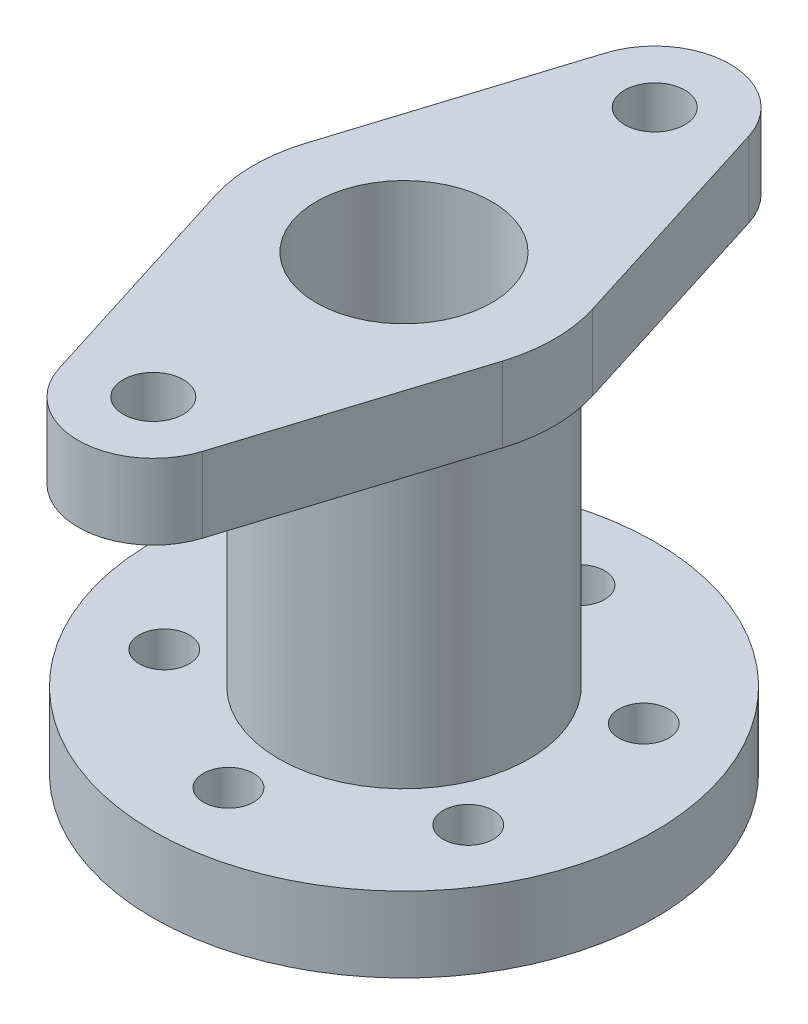
ISO-10303-21;
HEADER;
FILE_DESCRIPTION(('STEP AP214'),'2;1');
FILE_NAME('part.step','',(''),(''),'','','');
FILE_SCHEMA(('AUTOMOTIVE_DESIGN { 1 0 10303 214 1 1 1 1 }'));
ENDSEC;
DATA;
#1=APPLICATION_CONTEXT('core data for automotive mechanical design processes');
#2=APPLICATION_PROTOCOL_DEFINITION('international standard','automotive_design',2000,#1);
#3=PRODUCT_CONTEXT('',#1,'mechanical');
#4=PRODUCT('Part','Part','',(#3));
#5=PRODUCT_RELATED_PRODUCT_CATEGORY('part','',(#4));
#6=PRODUCT_DEFINITION_FORMATION('','',#4);
#7=PRODUCT_DEFINITION_CONTEXT('part definition',#1,'design');
#8=PRODUCT_DEFINITION('design','',#6,#7);
#9=PRODUCT_DEFINITION_SHAPE('','',#8);
#10=(LENGTH_UNIT() NAMED_UNIT(*) SI_UNIT(.MILLI.,.METRE.));
#11=(NAMED_UNIT(*) PLANE_ANGLE_UNIT() SI_UNIT($,.RADIAN.));
#12=(NAMED_UNIT(*) SI_UNIT($,.STERADIAN.) SOLID_ANGLE_UNIT());
#13=UNCERTAINTY_MEASURE_WITH_UNIT(LENGTH_MEASURE(1.E-05),#10,'distance_accuracy_value','');
#14=(GEOMETRIC_REPRESENTATION_CONTEXT(3) GLOBAL_UNCERTAINTY_ASSIGNED_CONTEXT((#13)) GLOBAL_UNIT_ASSIGNED_CONTEXT((#10,
#11,#12)) REPRESENTATION_CONTEXT('',''));
#15=CARTESIAN_POINT('',(0.,0.,0.));
#16=DIRECTION('',(0.,0.,1.));
#17=DIRECTION('',(1.,0.,0.));
#18=AXIS2_PLACEMENT_3D('',#15,#16,#17);
#19=CARTESIAN_POINT('',(0.,15.,0.));
#20=DIRECTION('',(0.,-1.,0.));
#21=DIRECTION('',(0.,0.,-1.));
#22=AXIS2_PLACEMENT_3D('',#19,#20,#21);
#23=CYLINDRICAL_SURFACE('',#22,50.);
#24=CARTESIAN_POINT('',(0.,15.,0.));
#25=DIRECTION('',(0.,1.,0.));
#26=DIRECTION('',(0.,0.,1.));
#27=AXIS2_PLACEMENT_3D('',#24,#25,#26);
#28=CIRCLE('',#27,50.);
#29=CARTESIAN_POINT('',(0.,15.,50.));
#30=VERTEX_POINT('',#29);
#31=EDGE_CURVE('E65',#30,#30,#28,.T.);
#32=ORIENTED_EDGE('',*,*,#31,.F.);
#33=EDGE_LOOP('',(#32));
#34=FACE_BOUND('',#33,.T.);
#35=CARTESIAN_POINT('',(0.,0.,0.));
#36=DIRECTION('',(0.,1.,0.));
#37=DIRECTION('',(0.,0.,1.));
#38=AXIS2_PLACEMENT_3D('',#35,#36,#37);
#39=CIRCLE('',#38,50.);
#40=CARTESIAN_POINT('',(0.,0.,50.));
#41=VERTEX_POINT('',#40);
#42=EDGE_CURVE('E217',#41,#41,#39,.T.);
#43=ORIENTED_EDGE('',*,*,#42,.T.);
#44=EDGE_LOOP('',(#43));
#45=FACE_BOUND('',#44,.T.);
#46=ADVANCED_FACE('F55',(#34,#45),#23,.T.);
#47=CARTESIAN_POINT('',(0.,15.,0.));
#48=DIRECTION('',(0.,1.,0.));
#49=DIRECTION('',(0.,0.,1.));
#50=AXIS2_PLACEMENT_3D('',#47,#48,#49);
#51=PLANE('',#50);
#52=CARTESIAN_POINT('',(0.,15.,0.));
#53=DIRECTION('',(0.,1.,0.));
#54=DIRECTION('',(0.,0.,1.));
#55=AXIS2_PLACEMENT_3D('',#52,#53,#54);
#56=CIRCLE('',#55,25.);
#57=CARTESIAN_POINT('',(0.,15.,25.));
#58=VERTEX_POINT('',#57);
#59=EDGE_CURVE('E204',#58,#58,#56,.T.);
#60=ORIENTED_EDGE('',*,*,#59,.F.);
#61=EDGE_LOOP('',(#60));
#62=FACE_BOUND('',#61,.T.);
#63=CARTESIAN_POINT('',(0.,15.,-35.));
#64=DIRECTION('',(0.,1.,0.));
#65=DIRECTION('',(0.,0.,1.));
#66=AXIS2_PLACEMENT_3D('',#63,#64,#65);
#67=CIRCLE('',#66,5.);
#68=CARTESIAN_POINT('',(0.,15.,-30.));
#69=VERTEX_POINT('',#68);
#70=EDGE_CURVE('E218',#69,#69,#67,.T.);
#71=ORIENTED_EDGE('',*,*,#70,.F.);
#72=EDGE_LOOP('',(#71));
#73=FACE_BOUND('',#72,.T.);
#74=CARTESIAN_POINT('',(-30.3108891324552,15.,-17.5000000000004));
#75=DIRECTION('',(0.,1.,0.));
#76=DIRECTION('',(0.,0.,1.));
#77=AXIS2_PLACEMENT_3D('',#74,#75,#76);
#78=CIRCLE('',#77,5.);
#79=CARTESIAN_POINT('',(-30.3108891324552,15.,-12.5000000000004));
#80=VERTEX_POINT('',#79);
#81=EDGE_CURVE('E223',#80,#80,#78,.T.);
#82=ORIENTED_EDGE('',*,*,#81,.F.);
#83=EDGE_LOOP('',(#82));
#84=FACE_BOUND('',#83,.T.);
#85=CARTESIAN_POINT('',(-30.3108891324555,15.,17.4999999999997));
#86=DIRECTION('',(0.,1.,0.));
#87=DIRECTION('',(0.,0.,1.));
#88=AXIS2_PLACEMENT_3D('',#85,#86,#87);
#89=CIRCLE('',#88,5.);
#90=CARTESIAN_POINT('',(-30.3108891324555,15.,22.4999999999997));
#91=VERTEX_POINT('',#90);
#92=EDGE_CURVE('E254',#91,#91,#89,.T.);
#93=ORIENTED_EDGE('',*,*,#92,.F.);
#94=EDGE_LOOP('',(#93));
#95=FACE_BOUND('',#94,.T.);
#96=CARTESIAN_POINT('',(-2.30525905911205E-13,15.,35.));
#97=DIRECTION('',(0.,1.,0.));
#98=DIRECTION('',(0.,0.,1.));
#99=AXIS2_PLACEMENT_3D('',#96,#97,#98);
#100=CIRCLE('',#99,5.);
#101=CARTESIAN_POINT('',(-2.30525905911205E-13,15.,40.));
#102=VERTEX_POINT('',#101);
#103=EDGE_CURVE('E246',#102,#102,#100,.T.);
#104=ORIENTED_EDGE('',*,*,#103,.F.);
#105=EDGE_LOOP('',(#104));
#106=FACE_BOUND('',#105,.T.);
#107=CARTESIAN_POINT('',(30.3108891324553,15.,17.5000000000001));
#108=DIRECTION('',(0.,1.,0.));
#109=DIRECTION('',(0.,0.,1.));
#110=AXIS2_PLACEMENT_3D('',#107,#108,#109);
#111=CIRCLE('',#110,5.);
#112=CARTESIAN_POINT('',(30.3108891324553,15.,22.5000000000001));
#113=VERTEX_POINT('',#112);
#114=EDGE_CURVE('E238',#113,#113,#111,.T.);
#115=ORIENTED_EDGE('',*,*,#114,.F.);
#116=EDGE_LOOP('',(#115));
#117=FACE_BOUND('',#116,.T.);
#118=CARTESIAN_POINT('',(30.3108891324554,15.,-17.5));
#119=DIRECTION('',(0.,1.,0.));
#120=DIRECTION('',(0.,0.,1.));
#121=AXIS2_PLACEMENT_3D('',#118,#119,#120);
#122=CIRCLE('',#121,5.);
#123=CARTESIAN_POINT('',(30.3108891324554,15.,-12.5));
#124=VERTEX_POINT('',#123);
#125=EDGE_CURVE('E222',#124,#124,#122,.T.);
#126=ORIENTED_EDGE('',*,*,#125,.F.);
#127=EDGE_LOOP('',(#126));
#128=FACE_BOUND('',#127,.T.);
#129=ORIENTED_EDGE('',*,*,#31,.T.);
#130=EDGE_LOOP('',(#129));
#131=FACE_BOUND('',#130,.T.);
#132=ADVANCED_FACE('F272',(#62,#73,#84,#95,#106,#117,#128,#131),#51,.T.);
#133=CARTESIAN_POINT('',(0.,0.,0.));
#134=DIRECTION('',(0.,1.,0.));
#135=DIRECTION('',(0.,0.,1.));
#136=AXIS2_PLACEMENT_3D('',#133,#134,#135);
#137=PLANE('',#136);
#138=CARTESIAN_POINT('',(0.,0.,-35.));
#139=DIRECTION('',(0.,1.,0.));
#140=DIRECTION('',(0.,0.,1.));
#141=AXIS2_PLACEMENT_3D('',#138,#139,#140);
#142=CIRCLE('',#141,5.);
#143=CARTESIAN_POINT('',(0.,0.,-30.));
#144=VERTEX_POINT('',#143);
#145=EDGE_CURVE('E213',#144,#144,#142,.T.);
#146=ORIENTED_EDGE('',*,*,#145,.T.);
#147=EDGE_LOOP('',(#146));
#148=FACE_BOUND('',#147,.T.);
#149=CARTESIAN_POINT('',(-30.3108891324552,0.,-17.5000000000004));
#150=DIRECTION('',(0.,1.,0.));
#151=DIRECTION('',(0.,0.,1.));
#152=AXIS2_PLACEMENT_3D('',#149,#150,#151);
#153=CIRCLE('',#152,5.);
#154=CARTESIAN_POINT('',(-30.3108891324552,0.,-12.5000000000004));
#155=VERTEX_POINT('',#154);
#156=EDGE_CURVE('E209',#155,#155,#153,.T.);
#157=ORIENTED_EDGE('',*,*,#156,.T.);
#158=EDGE_LOOP('',(#157));
#159=FACE_BOUND('',#158,.T.);
#160=CARTESIAN_POINT('',(-30.3108891324555,0.,17.4999999999997));
#161=DIRECTION('',(0.,1.,0.));
#162=DIRECTION('',(0.,0.,1.));
#163=AXIS2_PLACEMENT_3D('',#160,#161,#162);
#164=CIRCLE('',#163,5.);
#165=CARTESIAN_POINT('',(-30.3108891324555,0.,22.4999999999997));
#166=VERTEX_POINT('',#165);
#167=EDGE_CURVE('E227',#166,#166,#164,.T.);
#168=ORIENTED_EDGE('',*,*,#167,.T.);
#169=EDGE_LOOP('',(#168));
#170=FACE_BOUND('',#169,.T.);
#171=CARTESIAN_POINT('',(-2.30525905911205E-13,0.,35.));
#172=DIRECTION('',(0.,1.,0.));
#173=DIRECTION('',(0.,0.,1.));
#174=AXIS2_PLACEMENT_3D('',#171,#172,#173);
#175=CIRCLE('',#174,5.);
#176=CARTESIAN_POINT('',(-2.30525905911205E-13,0.,40.));
#177=VERTEX_POINT('',#176);
#178=EDGE_CURVE('E250',#177,#177,#175,.T.);
#179=ORIENTED_EDGE('',*,*,#178,.T.);
#180=EDGE_LOOP('',(#179));
#181=FACE_BOUND('',#180,.T.);
#182=CARTESIAN_POINT('',(30.3108891324553,0.,17.5000000000001));
#183=DIRECTION('',(0.,1.,0.));
#184=DIRECTION('',(0.,0.,1.));
#185=AXIS2_PLACEMENT_3D('',#182,#183,#184);
#186=CIRCLE('',#185,5.);
#187=CARTESIAN_POINT('',(30.3108891324553,0.,22.5000000000001));
#188=VERTEX_POINT('',#187);
#189=EDGE_CURVE('E242',#188,#188,#186,.T.);
#190=ORIENTED_EDGE('',*,*,#189,.T.);
#191=EDGE_LOOP('',(#190));
#192=FACE_BOUND('',#191,.T.);
#193=CARTESIAN_POINT('',(30.3108891324554,0.,-17.5));
#194=DIRECTION('',(0.,1.,0.));
#195=DIRECTION('',(0.,0.,1.));
#196=AXIS2_PLACEMENT_3D('',#193,#194,#195);
#197=CIRCLE('',#196,5.);
#198=CARTESIAN_POINT('',(30.3108891324554,0.,-12.5));
#199=VERTEX_POINT('',#198);
#200=EDGE_CURVE('E234',#199,#199,#197,.T.);
#201=ORIENTED_EDGE('',*,*,#200,.T.);
#202=EDGE_LOOP('',(#201));
#203=FACE_BOUND('',#202,.T.);
#204=ORIENTED_EDGE('',*,*,#42,.F.);
#205=EDGE_LOOP('',(#204));
#206=FACE_BOUND('',#205,.T.);
#207=ADVANCED_FACE('F269',(#148,#159,#170,#181,#192,#203,#206),#137,.F.);
#208=CARTESIAN_POINT('',(30.3108891324554,0.,-17.5));
#209=DIRECTION('',(0.,1.,0.));
#210=DIRECTION('',(0.,0.,1.));
#211=AXIS2_PLACEMENT_3D('',#208,#209,#210);
#212=CYLINDRICAL_SURFACE('',#211,5.);
#213=ORIENTED_EDGE('',*,*,#200,.F.);
#214=EDGE_LOOP('',(#213));
#215=FACE_BOUND('',#214,.T.);
#216=ORIENTED_EDGE('',*,*,#125,.T.);
#217=EDGE_LOOP('',(#216));
#218=FACE_BOUND('',#217,.T.);
#219=ADVANCED_FACE('F271',(#215,#218),#212,.F.);
#220=CARTESIAN_POINT('',(30.3108891324553,0.,17.5000000000001));
#221=DIRECTION('',(0.,1.,0.));
#222=DIRECTION('',(0.,0.,1.));
#223=AXIS2_PLACEMENT_3D('',#220,#221,#222);
#224=CYLINDRICAL_SURFACE('',#223,5.);
#225=ORIENTED_EDGE('',*,*,#189,.F.);
#226=EDGE_LOOP('',(#225));
#227=FACE_BOUND('',#226,.T.);
#228=ORIENTED_EDGE('',*,*,#114,.T.);
#229=EDGE_LOOP('',(#228));
#230=FACE_BOUND('',#229,.T.);
#231=ADVANCED_FACE('F278',(#227,#230),#224,.F.);
#232=CARTESIAN_POINT('',(-2.30525905911205E-13,0.,35.));
#233=DIRECTION('',(0.,1.,0.));
#234=DIRECTION('',(0.,0.,1.));
#235=AXIS2_PLACEMENT_3D('',#232,#233,#234);
#236=CYLINDRICAL_SURFACE('',#235,5.);
#237=ORIENTED_EDGE('',*,*,#178,.F.);
#238=EDGE_LOOP('',(#237));
#239=FACE_BOUND('',#238,.T.);
#240=ORIENTED_EDGE('',*,*,#103,.T.);
#241=EDGE_LOOP('',(#240));
#242=FACE_BOUND('',#241,.T.);
#243=ADVANCED_FACE('F515',(#239,#242),#236,.F.);
#244=CARTESIAN_POINT('',(-30.3108891324555,0.,17.4999999999997));
#245=DIRECTION('',(0.,1.,0.));
#246=DIRECTION('',(0.,0.,1.));
#247=AXIS2_PLACEMENT_3D('',#244,#245,#246);
#248=CYLINDRICAL_SURFACE('',#247,5.);
#249=ORIENTED_EDGE('',*,*,#167,.F.);
#250=EDGE_LOOP('',(#249));
#251=FACE_BOUND('',#250,.T.);
#252=ORIENTED_EDGE('',*,*,#92,.T.);
#253=EDGE_LOOP('',(#252));
#254=FACE_BOUND('',#253,.T.);
#255=ADVANCED_FACE('F510',(#251,#254),#248,.F.);
#256=CARTESIAN_POINT('',(-30.3108891324552,0.,-17.5000000000004));
#257=DIRECTION('',(0.,1.,0.));
#258=DIRECTION('',(0.,0.,1.));
#259=AXIS2_PLACEMENT_3D('',#256,#257,#258);
#260=CYLINDRICAL_SURFACE('',#259,5.);
#261=ORIENTED_EDGE('',*,*,#156,.F.);
#262=EDGE_LOOP('',(#261));
#263=FACE_BOUND('',#262,.T.);
#264=ORIENTED_EDGE('',*,*,#81,.T.);
#265=EDGE_LOOP('',(#264));
#266=FACE_BOUND('',#265,.T.);
#267=ADVANCED_FACE('F507',(#263,#266),#260,.F.);
#268=CARTESIAN_POINT('',(0.,0.,-35.));
#269=DIRECTION('',(0.,1.,0.));
#270=DIRECTION('',(0.,0.,1.));
#271=AXIS2_PLACEMENT_3D('',#268,#269,#270);
#272=CYLINDRICAL_SURFACE('',#271,5.);
#273=ORIENTED_EDGE('',*,*,#145,.F.);
#274=EDGE_LOOP('',(#273));
#275=FACE_BOUND('',#274,.T.);
#276=ORIENTED_EDGE('',*,*,#70,.T.);
#277=EDGE_LOOP('',(#276));
#278=FACE_BOUND('',#277,.T.);
#279=ADVANCED_FACE('F303',(#275,#278),#272,.F.);
#280=CARTESIAN_POINT('',(0.,75.,0.));
#281=DIRECTION('',(0.,-1.,0.));
#282=DIRECTION('',(0.,0.,-1.));
#283=AXIS2_PLACEMENT_3D('',#280,#281,#282);
#284=CYLINDRICAL_SURFACE('',#283,25.);
#285=CARTESIAN_POINT('',(0.,75.,0.));
#286=DIRECTION('',(0.,1.,0.));
#287=DIRECTION('',(0.,0.,1.));
#288=AXIS2_PLACEMENT_3D('',#285,#286,#287);
#289=CIRCLE('',#288,25.);
#290=CARTESIAN_POINT('',(0.,75.,25.));
#291=VERTEX_POINT('',#290);
#292=EDGE_CURVE('E205',#291,#291,#289,.T.);
#293=ORIENTED_EDGE('',*,*,#292,.F.);
#294=EDGE_LOOP('',(#293));
#295=FACE_BOUND('',#294,.T.);
#296=ORIENTED_EDGE('',*,*,#59,.T.);
#297=EDGE_LOOP('',(#296));
#298=FACE_BOUND('',#297,.T.);
#299=ADVANCED_FACE('F308',(#295,#298),#284,.T.);
#300=CARTESIAN_POINT('',(0.,75.,-50.));
#301=DIRECTION('',(0.,1.,0.));
#302=DIRECTION('',(0.,0.,1.));
#303=AXIS2_PLACEMENT_3D('',#300,#301,#302);
#304=PLANE('',#303);
#305=CARTESIAN_POINT('',(0.,75.,-50.));
#306=DIRECTION('',(0.,1.,0.));
#307=DIRECTION('',(0.,0.,1.));
#308=AXIS2_PLACEMENT_3D('',#305,#306,#307);
#309=CIRCLE('',#308,6.);
#310=CARTESIAN_POINT('',(0.,75.,-44.));
#311=VERTEX_POINT('',#310);
#312=EDGE_CURVE('E614',#311,#311,#309,.T.);
#313=ORIENTED_EDGE('',*,*,#312,.T.);
#314=EDGE_LOOP('',(#313));
#315=FACE_BOUND('',#314,.T.);
#316=CARTESIAN_POINT('',(0.,75.,50.));
#317=DIRECTION('',(0.,1.,0.));
#318=DIRECTION('',(0.,0.,1.));
#319=AXIS2_PLACEMENT_3D('',#316,#317,#318);
#320=CIRCLE('',#319,6.);
#321=CARTESIAN_POINT('',(0.,75.,56.));
#322=VERTEX_POINT('',#321);
#323=EDGE_CURVE('E625',#322,#322,#320,.T.);
#324=ORIENTED_EDGE('',*,*,#323,.T.);
#325=EDGE_LOOP('',(#324));
#326=FACE_BOUND('',#325,.T.);
#327=CARTESIAN_POINT('',(0.,75.,-50.));
#328=DIRECTION('',(0.,1.,0.));
#329=DIRECTION('',(0.,0.,1.));
#330=AXIS2_PLACEMENT_3D('',#327,#328,#329);
#331=CIRCLE('',#330,15.);
#332=CARTESIAN_POINT('',(14.3090880212542,75.,-54.5));
#333=VERTEX_POINT('',#332);
#334=CARTESIAN_POINT('',(-14.3090880212542,75.,-54.5));
#335=VERTEX_POINT('',#334);
#336=EDGE_CURVE('E159',#333,#335,#331,.T.);
#337=ORIENTED_EDGE('',*,*,#336,.F.);
#338=DIRECTION('',(-0.3,0.,-0.953939201416946));
#339=VECTOR('',#338,1.);
#340=CARTESIAN_POINT('',(14.3090880212542,75.,-54.5));
#341=LINE('',#340,#339);
#342=CARTESIAN_POINT('',(28.6181760425084,75.,-8.99999999999999));
#343=VERTEX_POINT('',#342);
#344=EDGE_CURVE('E108',#343,#333,#341,.T.);
#345=ORIENTED_EDGE('',*,*,#344,.F.);
#346=CARTESIAN_POINT('',(0.,75.,0.));
#347=DIRECTION('',(0.,1.,0.));
#348=DIRECTION('',(0.,0.,1.));
#349=AXIS2_PLACEMENT_3D('',#346,#347,#348);
#350=CIRCLE('',#349,30.);
#351=CARTESIAN_POINT('',(28.6181760425084,75.,9.));
#352=VERTEX_POINT('',#351);
#353=EDGE_CURVE('E102',#352,#343,#350,.T.);
#354=ORIENTED_EDGE('',*,*,#353,.F.);
#355=DIRECTION('',(0.3,0.,-0.953939201416946));
#356=VECTOR('',#355,1.);
#357=CARTESIAN_POINT('',(14.3090880212542,75.,54.5));
#358=LINE('',#357,#356);
#359=CARTESIAN_POINT('',(14.3090880212542,75.,54.5));
#360=VERTEX_POINT('',#359);
#361=EDGE_CURVE('E146',#360,#352,#358,.T.);
#362=ORIENTED_EDGE('',*,*,#361,.F.);
#363=CARTESIAN_POINT('',(0.,75.,50.));
#364=DIRECTION('',(0.,1.,0.));
#365=DIRECTION('',(0.,0.,1.));
#366=AXIS2_PLACEMENT_3D('',#363,#364,#365);
#367=CIRCLE('',#366,15.);
#368=CARTESIAN_POINT('',(-14.3090880212542,75.,54.5));
#369=VERTEX_POINT('',#368);
#370=EDGE_CURVE('E173',#369,#360,#367,.T.);
#371=ORIENTED_EDGE('',*,*,#370,.F.);
#372=DIRECTION('',(0.3,0.,0.953939201416946));
#373=VECTOR('',#372,1.);
#374=CARTESIAN_POINT('',(-14.3090880212542,75.,54.5));
#375=LINE('',#374,#373);
#376=CARTESIAN_POINT('',(-28.6181760425084,75.,8.99999999999999));
#377=VERTEX_POINT('',#376);
#378=EDGE_CURVE('E170',#377,#369,#375,.T.);
#379=ORIENTED_EDGE('',*,*,#378,.F.);
#380=CARTESIAN_POINT('',(0.,75.,0.));
#381=DIRECTION('',(0.,1.,0.));
#382=DIRECTION('',(0.,0.,1.));
#383=AXIS2_PLACEMENT_3D('',#380,#381,#382);
#384=CIRCLE('',#383,30.);
#385=CARTESIAN_POINT('',(-28.6181760425084,75.,-9.00000000000001));
#386=VERTEX_POINT('',#385);
#387=EDGE_CURVE('E167',#386,#377,#384,.T.);
#388=ORIENTED_EDGE('',*,*,#387,.F.);
#389=DIRECTION('',(-0.3,0.,0.953939201416946));
#390=VECTOR('',#389,1.);
#391=CARTESIAN_POINT('',(-14.3090880212542,75.,-54.5));
#392=LINE('',#391,#390);
#393=EDGE_CURVE('E163',#335,#386,#392,.T.);
#394=ORIENTED_EDGE('',*,*,#393,.F.);
#395=EDGE_LOOP('',(#337,#345,#354,#362,#371,#379,#388,#394));
#396=FACE_BOUND('',#395,.T.);
#397=ORIENTED_EDGE('',*,*,#292,.T.);
#398=EDGE_LOOP('',(#397));
#399=FACE_BOUND('',#398,.T.);
#400=ADVANCED_FACE('F313',(#315,#326,#396,#399),#304,.F.);
#401=CARTESIAN_POINT('',(0.,90.,-50.));
#402=DIRECTION('',(0.,1.,0.));
#403=DIRECTION('',(0.,0.,1.));
#404=AXIS2_PLACEMENT_3D('',#401,#402,#403);
#405=PLANE('',#404);
#406=CARTESIAN_POINT('',(0.,90.,-50.));
#407=DIRECTION('',(0.,1.,0.));
#408=DIRECTION('',(0.,0.,1.));
#409=AXIS2_PLACEMENT_3D('',#406,#407,#408);
#410=CIRCLE('',#409,6.);
#411=CARTESIAN_POINT('',(0.,90.,-44.));
#412=VERTEX_POINT('',#411);
#413=EDGE_CURVE('E621',#412,#412,#410,.T.);
#414=ORIENTED_EDGE('',*,*,#413,.F.);
#415=EDGE_LOOP('',(#414));
#416=FACE_BOUND('',#415,.T.);
#417=CARTESIAN_POINT('',(0.,90.,-50.));
#418=DIRECTION('',(0.,1.,0.));
#419=DIRECTION('',(0.,0.,1.));
#420=AXIS2_PLACEMENT_3D('',#417,#418,#419);
#421=CIRCLE('',#420,15.);
#422=CARTESIAN_POINT('',(14.3090880212542,90.,-54.5));
#423=VERTEX_POINT('',#422);
#424=CARTESIAN_POINT('',(-14.3090880212542,90.,-54.5));
#425=VERTEX_POINT('',#424);
#426=EDGE_CURVE('E182',#423,#425,#421,.T.);
#427=ORIENTED_EDGE('',*,*,#426,.T.);
#428=DIRECTION('',(-0.3,0.,0.953939201416946));
#429=VECTOR('',#428,1.);
#430=CARTESIAN_POINT('',(-14.3090880212542,90.,-54.5));
#431=LINE('',#430,#429);
#432=CARTESIAN_POINT('',(-28.6181760425084,90.,-9.00000000000001));
#433=VERTEX_POINT('',#432);
#434=EDGE_CURVE('E117',#425,#433,#431,.T.);
#435=ORIENTED_EDGE('',*,*,#434,.T.);
#436=CARTESIAN_POINT('',(0.,90.,0.));
#437=DIRECTION('',(0.,1.,0.));
#438=DIRECTION('',(0.,0.,1.));
#439=AXIS2_PLACEMENT_3D('',#436,#437,#438);
#440=CIRCLE('',#439,30.);
#441=CARTESIAN_POINT('',(-28.6181760425084,90.,8.99999999999999));
#442=VERTEX_POINT('',#441);
#443=EDGE_CURVE('E639',#433,#442,#440,.T.);
#444=ORIENTED_EDGE('',*,*,#443,.T.);
#445=DIRECTION('',(0.3,0.,0.953939201416946));
#446=VECTOR('',#445,1.);
#447=CARTESIAN_POINT('',(-14.3090880212542,90.,54.5));
#448=LINE('',#447,#446);
#449=CARTESIAN_POINT('',(-14.3090880212542,90.,54.5));
#450=VERTEX_POINT('',#449);
#451=EDGE_CURVE('E642',#442,#450,#448,.T.);
#452=ORIENTED_EDGE('',*,*,#451,.T.);
#453=CARTESIAN_POINT('',(0.,90.,50.));
#454=DIRECTION('',(0.,1.,0.));
#455=DIRECTION('',(0.,0.,1.));
#456=AXIS2_PLACEMENT_3D('',#453,#454,#455);
#457=CIRCLE('',#456,15.);
#458=CARTESIAN_POINT('',(14.3090880212542,90.,54.5));
#459=VERTEX_POINT('',#458);
#460=EDGE_CURVE('E137',#450,#459,#457,.T.);
#461=ORIENTED_EDGE('',*,*,#460,.T.);
#462=DIRECTION('',(0.3,0.,-0.953939201416946));
#463=VECTOR('',#462,1.);
#464=CARTESIAN_POINT('',(14.3090880212542,90.,54.5));
#465=LINE('',#464,#463);
#466=CARTESIAN_POINT('',(28.6181760425084,90.,9.));
#467=VERTEX_POINT('',#466);
#468=EDGE_CURVE('E130',#459,#467,#465,.T.);
#469=ORIENTED_EDGE('',*,*,#468,.T.);
#470=CARTESIAN_POINT('',(0.,90.,0.));
#471=DIRECTION('',(0.,1.,0.));
#472=DIRECTION('',(0.,0.,1.));
#473=AXIS2_PLACEMENT_3D('',#470,#471,#472);
#474=CIRCLE('',#473,30.);
#475=CARTESIAN_POINT('',(28.6181760425084,90.,-8.99999999999999));
#476=VERTEX_POINT('',#475);
#477=EDGE_CURVE('E135',#467,#476,#474,.T.);
#478=ORIENTED_EDGE('',*,*,#477,.T.);
#479=DIRECTION('',(-0.3,0.,-0.953939201416946));
#480=VECTOR('',#479,1.);
#481=CARTESIAN_POINT('',(14.3090880212542,90.,-54.5));
#482=LINE('',#481,#480);
#483=EDGE_CURVE('E73',#476,#423,#482,.T.);
#484=ORIENTED_EDGE('',*,*,#483,.T.);
#485=EDGE_LOOP('',(#427,#435,#444,#452,#461,#469,#478,#484));
#486=FACE_BOUND('',#485,.T.);
#487=CARTESIAN_POINT('',(0.,90.,50.));
#488=DIRECTION('',(0.,1.,0.));
#489=DIRECTION('',(0.,0.,1.));
#490=AXIS2_PLACEMENT_3D('',#487,#488,#489);
#491=CIRCLE('',#490,6.);
#492=CARTESIAN_POINT('',(0.,90.,56.));
#493=VERTEX_POINT('',#492);
#494=EDGE_CURVE('E164',#493,#493,#491,.T.);
#495=ORIENTED_EDGE('',*,*,#494,.F.);
#496=EDGE_LOOP('',(#495));
#497=FACE_BOUND('',#496,.T.);
#498=CARTESIAN_POINT('',(0.,90.,0.));
#499=DIRECTION('',(0.,1.,0.));
#500=DIRECTION('',(0.,0.,1.));
#501=AXIS2_PLACEMENT_3D('',#498,#499,#500);
#502=CIRCLE('',#501,17.5);
#503=CARTESIAN_POINT('',(0.,90.,17.5));
#504=VERTEX_POINT('',#503);
#505=EDGE_CURVE('E609',#504,#504,#502,.T.);
#506=ORIENTED_EDGE('',*,*,#505,.F.);
#507=EDGE_LOOP('',(#506));
#508=FACE_BOUND('',#507,.T.);
#509=ADVANCED_FACE('F132',(#416,#486,#497,#508),#405,.T.);
#510=CARTESIAN_POINT('',(0.,90.,-50.));
#511=DIRECTION('',(0.,-1.,0.));
#512=DIRECTION('',(0.,0.,-1.));
#513=AXIS2_PLACEMENT_3D('',#510,#511,#512);
#514=CYLINDRICAL_SURFACE('',#513,15.);
#515=ORIENTED_EDGE('',*,*,#336,.T.);
#516=DIRECTION('',(0.,-1.,0.));
#517=VECTOR('',#516,1.);
#518=CARTESIAN_POINT('',(-14.3090880212542,90.,-54.5));
#519=LINE('',#518,#517);
#520=EDGE_CURVE('E201',#425,#335,#519,.T.);
#521=ORIENTED_EDGE('',*,*,#520,.F.);
#522=ORIENTED_EDGE('',*,*,#426,.F.);
#523=DIRECTION('',(0.,-1.,0.));
#524=VECTOR('',#523,1.);
#525=CARTESIAN_POINT('',(14.3090880212542,90.,-54.5));
#526=LINE('',#525,#524);
#527=EDGE_CURVE('E155',#423,#333,#526,.T.);
#528=ORIENTED_EDGE('',*,*,#527,.T.);
#529=EDGE_LOOP('',(#515,#521,#522,#528));
#530=FACE_BOUND('',#529,.T.);
#531=ADVANCED_FACE('F347',(#530),#514,.T.);
#532=CARTESIAN_POINT('',(-14.3090880212542,90.,-54.5));
#533=DIRECTION('',(0.953939201416946,0.,0.3));
#534=DIRECTION('',(0.3,0.,-0.953939201416946));
#535=AXIS2_PLACEMENT_3D('',#532,#533,#534);
#536=PLANE('',#535);
#537=ORIENTED_EDGE('',*,*,#393,.T.);
#538=DIRECTION('',(0.,-1.,0.));
#539=VECTOR('',#538,1.);
#540=CARTESIAN_POINT('',(-28.6181760425084,90.,-9.00000000000001));
#541=LINE('',#540,#539);
#542=EDGE_CURVE('E197',#433,#386,#541,.T.);
#543=ORIENTED_EDGE('',*,*,#542,.F.);
#544=ORIENTED_EDGE('',*,*,#434,.F.);
#545=ORIENTED_EDGE('',*,*,#520,.T.);
#546=EDGE_LOOP('',(#537,#543,#544,#545));
#547=FACE_BOUND('',#546,.T.);
#548=ADVANCED_FACE('F358',(#547),#536,.F.);
#549=CARTESIAN_POINT('',(0.,90.,0.));
#550=DIRECTION('',(0.,-1.,0.));
#551=DIRECTION('',(0.,0.,-1.));
#552=AXIS2_PLACEMENT_3D('',#549,#550,#551);
#553=CYLINDRICAL_SURFACE('',#552,30.);
#554=ORIENTED_EDGE('',*,*,#387,.T.);
#555=DIRECTION('',(0.,-1.,0.));
#556=VECTOR('',#555,1.);
#557=CARTESIAN_POINT('',(-28.6181760425084,90.,8.99999999999999));
#558=LINE('',#557,#556);
#559=EDGE_CURVE('E193',#442,#377,#558,.T.);
#560=ORIENTED_EDGE('',*,*,#559,.F.);
#561=ORIENTED_EDGE('',*,*,#443,.F.);
#562=ORIENTED_EDGE('',*,*,#542,.T.);
#563=EDGE_LOOP('',(#554,#560,#561,#562));
#564=FACE_BOUND('',#563,.T.);
#565=ADVANCED_FACE('F369',(#564),#553,.T.);
#566=CARTESIAN_POINT('',(-14.3090880212542,90.,54.5));
#567=DIRECTION('',(0.953939201416946,0.,-0.3));
#568=DIRECTION('',(-0.3,0.,-0.953939201416946));
#569=AXIS2_PLACEMENT_3D('',#566,#567,#568);
#570=PLANE('',#569);
#571=ORIENTED_EDGE('',*,*,#378,.T.);
#572=DIRECTION('',(0.,-1.,0.));
#573=VECTOR('',#572,1.);
#574=CARTESIAN_POINT('',(-14.3090880212542,90.,54.5));
#575=LINE('',#574,#573);
#576=EDGE_CURVE('E189',#450,#369,#575,.T.);
#577=ORIENTED_EDGE('',*,*,#576,.F.);
#578=ORIENTED_EDGE('',*,*,#451,.F.);
#579=ORIENTED_EDGE('',*,*,#559,.T.);
#580=EDGE_LOOP('',(#571,#577,#578,#579));
#581=FACE_BOUND('',#580,.T.);
#582=ADVANCED_FACE('F379',(#581),#570,.F.);
#583=CARTESIAN_POINT('',(0.,90.,50.));
#584=DIRECTION('',(0.,-1.,0.));
#585=DIRECTION('',(0.,0.,-1.));
#586=AXIS2_PLACEMENT_3D('',#583,#584,#585);
#587=CYLINDRICAL_SURFACE('',#586,15.);
#588=ORIENTED_EDGE('',*,*,#370,.T.);
#589=DIRECTION('',(0.,-1.,0.));
#590=VECTOR('',#589,1.);
#591=CARTESIAN_POINT('',(14.3090880212542,90.,54.5));
#592=LINE('',#591,#590);
#593=EDGE_CURVE('E148',#459,#360,#592,.T.);
#594=ORIENTED_EDGE('',*,*,#593,.F.);
#595=ORIENTED_EDGE('',*,*,#460,.F.);
#596=ORIENTED_EDGE('',*,*,#576,.T.);
#597=EDGE_LOOP('',(#588,#594,#595,#596));
#598=FACE_BOUND('',#597,.T.);
#599=ADVANCED_FACE('F390',(#598),#587,.T.);
#600=CARTESIAN_POINT('',(14.3090880212542,90.,54.5));
#601=DIRECTION('',(-0.953939201416946,0.,-0.3));
#602=DIRECTION('',(-0.3,0.,0.953939201416946));
#603=AXIS2_PLACEMENT_3D('',#600,#601,#602);
#604=PLANE('',#603);
#605=ORIENTED_EDGE('',*,*,#361,.T.);
#606=DIRECTION('',(0.,-1.,0.));
#607=VECTOR('',#606,1.);
#608=CARTESIAN_POINT('',(28.6181760425084,90.,9.));
#609=LINE('',#608,#607);
#610=EDGE_CURVE('E143',#467,#352,#609,.T.);
#611=ORIENTED_EDGE('',*,*,#610,.F.);
#612=ORIENTED_EDGE('',*,*,#468,.F.);
#613=ORIENTED_EDGE('',*,*,#593,.T.);
#614=EDGE_LOOP('',(#605,#611,#612,#613));
#615=FACE_BOUND('',#614,.T.);
#616=ADVANCED_FACE('F144',(#615),#604,.F.);
#617=CARTESIAN_POINT('',(0.,90.,0.));
#618=DIRECTION('',(0.,-1.,0.));
#619=DIRECTION('',(0.,0.,-1.));
#620=AXIS2_PLACEMENT_3D('',#617,#618,#619);
#621=CYLINDRICAL_SURFACE('',#620,30.);
#622=ORIENTED_EDGE('',*,*,#353,.T.);
#623=DIRECTION('',(0.,-1.,0.));
#624=VECTOR('',#623,1.);
#625=CARTESIAN_POINT('',(28.6181760425084,90.,-8.99999999999999));
#626=LINE('',#625,#624);
#627=EDGE_CURVE('E149',#476,#343,#626,.T.);
#628=ORIENTED_EDGE('',*,*,#627,.F.);
#629=ORIENTED_EDGE('',*,*,#477,.F.);
#630=ORIENTED_EDGE('',*,*,#610,.T.);
#631=EDGE_LOOP('',(#622,#628,#629,#630));
#632=FACE_BOUND('',#631,.T.);
#633=ADVANCED_FACE('F151',(#632),#621,.T.);
#634=CARTESIAN_POINT('',(14.3090880212542,90.,-54.5));
#635=DIRECTION('',(-0.953939201416946,0.,0.3));
#636=DIRECTION('',(0.3,0.,0.953939201416946));
#637=AXIS2_PLACEMENT_3D('',#634,#635,#636);
#638=PLANE('',#637);
#639=ORIENTED_EDGE('',*,*,#344,.T.);
#640=ORIENTED_EDGE('',*,*,#527,.F.);
#641=ORIENTED_EDGE('',*,*,#483,.F.);
#642=ORIENTED_EDGE('',*,*,#627,.T.);
#643=EDGE_LOOP('',(#639,#640,#641,#642));
#644=FACE_BOUND('',#643,.T.);
#645=ADVANCED_FACE('F420',(#644),#638,.F.);
#646=CARTESIAN_POINT('',(0.,90.,50.));
#647=DIRECTION('',(0.,-1.,0.));
#648=DIRECTION('',(0.,0.,-1.));
#649=AXIS2_PLACEMENT_3D('',#646,#647,#648);
#650=CYLINDRICAL_SURFACE('',#649,6.);
#651=ORIENTED_EDGE('',*,*,#494,.T.);
#652=EDGE_LOOP('',(#651));
#653=FACE_BOUND('',#652,.T.);
#654=ORIENTED_EDGE('',*,*,#323,.F.);
#655=EDGE_LOOP('',(#654));
#656=FACE_BOUND('',#655,.T.);
#657=ADVANCED_FACE('F430',(#653,#656),#650,.F.);
#658=CARTESIAN_POINT('',(0.,90.,-50.));
#659=DIRECTION('',(0.,-1.,0.));
#660=DIRECTION('',(0.,0.,-1.));
#661=AXIS2_PLACEMENT_3D('',#658,#659,#660);
#662=CYLINDRICAL_SURFACE('',#661,6.);
#663=ORIENTED_EDGE('',*,*,#413,.T.);
#664=EDGE_LOOP('',(#663));
#665=FACE_BOUND('',#664,.T.);
#666=ORIENTED_EDGE('',*,*,#312,.F.);
#667=EDGE_LOOP('',(#666));
#668=FACE_BOUND('',#667,.T.);
#669=ADVANCED_FACE('F440',(#665,#668),#662,.F.);
#670=CARTESIAN_POINT('',(0.,90.,0.));
#671=DIRECTION('',(0.,-1.,0.));
#672=DIRECTION('',(0.,0.,-1.));
#673=AXIS2_PLACEMENT_3D('',#670,#671,#672);
#674=CYLINDRICAL_SURFACE('',#673,17.5);
#675=ORIENTED_EDGE('',*,*,#505,.T.);
#676=EDGE_LOOP('',(#675));
#677=FACE_BOUND('',#676,.T.);
#678=CARTESIAN_POINT('',(0.,60.,0.));
#679=DIRECTION('',(0.,1.,0.));
#680=DIRECTION('',(0.,0.,1.));
#681=AXIS2_PLACEMENT_3D('',#678,#679,#680);
#682=CIRCLE('',#681,17.5);
#683=CARTESIAN_POINT('',(0.,60.,17.5));
#684=VERTEX_POINT('',#683);
#685=EDGE_CURVE('E610',#684,#684,#682,.T.);
#686=ORIENTED_EDGE('',*,*,#685,.F.);
#687=EDGE_LOOP('',(#686));
#688=FACE_BOUND('',#687,.T.);
#689=ADVANCED_FACE('F451',(#677,#688),#674,.F.);
#690=CARTESIAN_POINT('',(0.,60.,0.));
#691=DIRECTION('',(0.,1.,0.));
#692=DIRECTION('',(0.,0.,1.));
#693=AXIS2_PLACEMENT_3D('',#690,#691,#692);
#694=PLANE('',#693);
#695=CARTESIAN_POINT('',(0.,60.,0.));
#696=DIRECTION('',(0.,1.,0.));
#697=DIRECTION('',(0.,0.,1.));
#698=AXIS2_PLACEMENT_3D('',#695,#696,#697);
#699=CIRCLE('',#698,13.);
#700=CARTESIAN_POINT('',(0.,60.,13.));
#701=VERTEX_POINT('',#700);
#702=EDGE_CURVE('E58',#701,#701,#699,.T.);
#703=ORIENTED_EDGE('',*,*,#702,.F.);
#704=EDGE_LOOP('',(#703));
#705=FACE_BOUND('',#704,.T.);
#706=ORIENTED_EDGE('',*,*,#685,.T.);
#707=EDGE_LOOP('',(#706));
#708=FACE_BOUND('',#707,.T.);
#709=ADVANCED_FACE('F328',(#705,#708),#694,.T.);
#710=CARTESIAN_POINT('',(0.,15.,0.));
#711=DIRECTION('',(0.,1.,0.));
#712=DIRECTION('',(0.,0.,1.));
#713=AXIS2_PLACEMENT_3D('',#710,#711,#712);
#714=CIRCLE('',#713,13.);
#715=CARTESIAN_POINT('',(0.,15.,13.));
#716=VERTEX_POINT('',#715);
#717=EDGE_CURVE('E13',#716,#716,#714,.F.);
#718=ORIENTED_EDGE('',*,*,#717,.F.);
#719=EDGE_LOOP('',(#718));
#720=FACE_BOUND('',#719,.T.);
#721=ADVANCED_FACE('F283',(#720),#51,.T.);
#722=CARTESIAN_POINT('',(0.,75.,0.));
#723=DIRECTION('',(0.,-1.,0.));
#724=DIRECTION('',(0.,0.,-1.));
#725=AXIS2_PLACEMENT_3D('',#722,#723,#724);
#726=CYLINDRICAL_SURFACE('',#725,13.);
#727=ORIENTED_EDGE('',*,*,#717,.T.);
#728=EDGE_LOOP('',(#727));
#729=FACE_BOUND('',#728,.T.);
#730=ORIENTED_EDGE('',*,*,#702,.T.);
#731=EDGE_LOOP('',(#730));
#732=FACE_BOUND('',#731,.T.);
#733=ADVANCED_FACE('F327',(#729,#732),#726,.F.);
#734=CLOSED_SHELL('',(#46,#132,#207,#219,#231,#243,#255,#267,#279,#299,#400,#509,#531,#548,#565,
#582,#599,#616,#633,#645,#657,#669,#689,#709,#721,#733));
#735=MANIFOLD_SOLID_BREP('B2',#734);
#736=ADVANCED_BREP_SHAPE_REPRESENTATION('',(#18,#735),#14);
#737=SHAPE_DEFINITION_REPRESENTATION(#9,#736);
ENDSEC;
END-ISO-10303-21;
